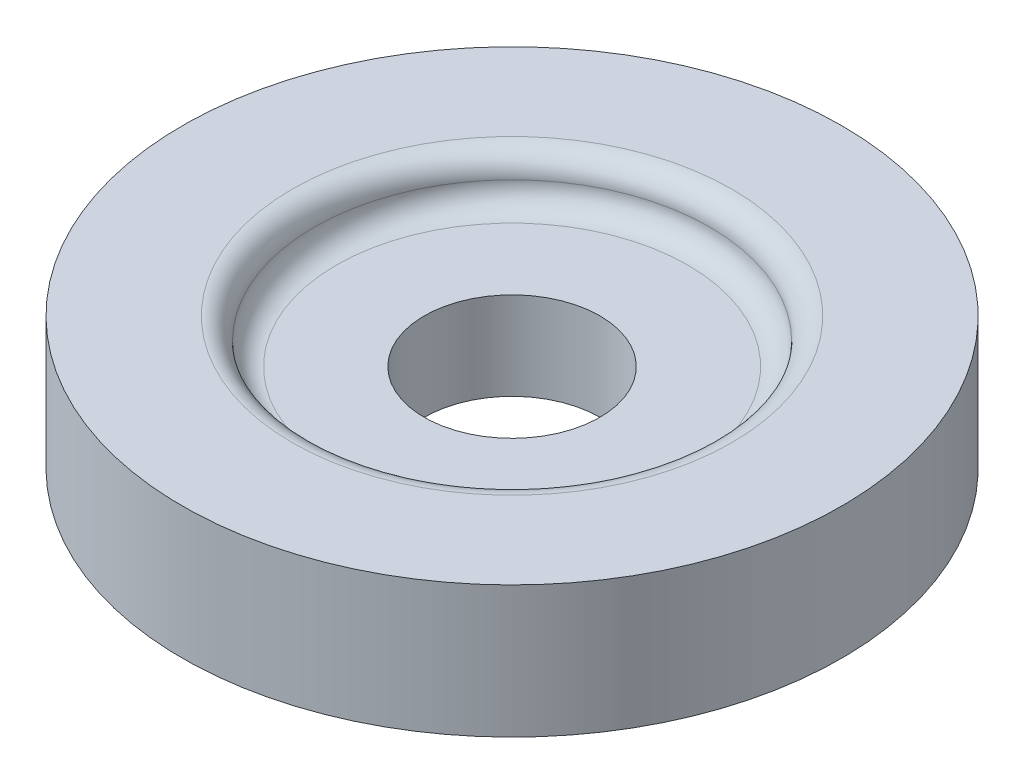
ISO-10303-21;
HEADER;
FILE_DESCRIPTION(('STEP AP214'),'2;1');
FILE_NAME('part.step','',(''),(''),'','','');
FILE_SCHEMA(('AUTOMOTIVE_DESIGN { 1 0 10303 214 1 1 1 1 }'));
ENDSEC;
DATA;
#1=APPLICATION_CONTEXT('core data for automotive mechanical design processes');
#2=APPLICATION_PROTOCOL_DEFINITION('international standard','automotive_design',2000,#1);
#3=PRODUCT_CONTEXT('',#1,'mechanical');
#4=PRODUCT('Part','Part','',(#3));
#5=PRODUCT_RELATED_PRODUCT_CATEGORY('part','',(#4));
#6=PRODUCT_DEFINITION_FORMATION('','',#4);
#7=PRODUCT_DEFINITION_CONTEXT('part definition',#1,'design');
#8=PRODUCT_DEFINITION('design','',#6,#7);
#9=PRODUCT_DEFINITION_SHAPE('','',#8);
#10=(LENGTH_UNIT() NAMED_UNIT(*) SI_UNIT(.MILLI.,.METRE.));
#11=(NAMED_UNIT(*) PLANE_ANGLE_UNIT() SI_UNIT($,.RADIAN.));
#12=(NAMED_UNIT(*) SI_UNIT($,.STERADIAN.) SOLID_ANGLE_UNIT());
#13=UNCERTAINTY_MEASURE_WITH_UNIT(LENGTH_MEASURE(1.E-05),#10,'distance_accuracy_value','');
#14=(GEOMETRIC_REPRESENTATION_CONTEXT(3) GLOBAL_UNCERTAINTY_ASSIGNED_CONTEXT((#13)) GLOBAL_UNIT_ASSIGNED_CONTEXT((#10,
#11,#12)) REPRESENTATION_CONTEXT('',''));
#15=CARTESIAN_POINT('',(0.,0.,0.));
#16=DIRECTION('',(0.,0.,1.));
#17=DIRECTION('',(1.,0.,0.));
#18=AXIS2_PLACEMENT_3D('',#15,#16,#17);
#19=CARTESIAN_POINT('',(0.,0.,0.));
#20=DIRECTION('',(0.,-1.,0.));
#21=DIRECTION('',(0.,0.,-1.));
#22=AXIS2_PLACEMENT_3D('',#19,#20,#21);
#23=CYLINDRICAL_SURFACE('',#22,7.5);
#24=CARTESIAN_POINT('',(0.,3.,0.));
#25=DIRECTION('',(0.,-1.,0.));
#26=DIRECTION('',(0.,0.,-1.));
#27=AXIS2_PLACEMENT_3D('',#24,#25,#26);
#28=CIRCLE('',#27,7.5);
#29=CARTESIAN_POINT('',(0.,3.,-7.5));
#30=VERTEX_POINT('',#29);
#31=EDGE_CURVE('E45',#30,#30,#28,.T.);
#32=ORIENTED_EDGE('',*,*,#31,.T.);
#33=EDGE_LOOP('',(#32));
#34=FACE_BOUND('',#33,.T.);
#35=CARTESIAN_POINT('',(0.,0.,0.));
#36=DIRECTION('',(0.,-1.,0.));
#37=DIRECTION('',(0.,0.,-1.));
#38=AXIS2_PLACEMENT_3D('',#35,#36,#37);
#39=CIRCLE('',#38,7.5);
#40=CARTESIAN_POINT('',(0.,0.,-7.5));
#41=VERTEX_POINT('',#40);
#42=EDGE_CURVE('E56',#41,#41,#39,.T.);
#43=ORIENTED_EDGE('',*,*,#42,.F.);
#44=EDGE_LOOP('',(#43));
#45=FACE_BOUND('',#44,.T.);
#46=ADVANCED_FACE('F33',(#34,#45),#23,.T.);
#47=CARTESIAN_POINT('',(7.5,3.,0.));
#48=DIRECTION('',(0.,1.,0.));
#49=DIRECTION('',(0.,0.,1.));
#50=AXIS2_PLACEMENT_3D('',#47,#48,#49);
#51=PLANE('',#50);
#52=CARTESIAN_POINT('',(0.,3.,0.));
#53=DIRECTION('',(0.,1.,0.));
#54=DIRECTION('',(0.,0.,1.));
#55=AXIS2_PLACEMENT_3D('',#52,#53,#54);
#56=CIRCLE('',#55,5.);
#57=CARTESIAN_POINT('',(0.,3.,5.));
#58=VERTEX_POINT('',#57);
#59=EDGE_CURVE('E10',#58,#58,#56,.F.);
#60=ORIENTED_EDGE('',*,*,#59,.T.);
#61=EDGE_LOOP('',(#60));
#62=FACE_BOUND('',#61,.T.);
#63=ORIENTED_EDGE('',*,*,#31,.F.);
#64=EDGE_LOOP('',(#63));
#65=FACE_BOUND('',#64,.T.);
#66=ADVANCED_FACE('F76',(#62,#65),#51,.T.);
#67=CARTESIAN_POINT('',(4.5,2.,0.));
#68=DIRECTION('',(0.,1.,0.));
#69=DIRECTION('',(0.,0.,1.));
#70=AXIS2_PLACEMENT_3D('',#67,#68,#69);
#71=PLANE('',#70);
#72=CARTESIAN_POINT('',(0.,2.,0.));
#73=DIRECTION('',(0.,1.,0.));
#74=DIRECTION('',(0.,0.,1.));
#75=AXIS2_PLACEMENT_3D('',#72,#73,#74);
#76=CIRCLE('',#75,4.);
#77=CARTESIAN_POINT('',(0.,2.,4.));
#78=VERTEX_POINT('',#77);
#79=EDGE_CURVE('E41',#78,#78,#76,.T.);
#80=ORIENTED_EDGE('',*,*,#79,.T.);
#81=EDGE_LOOP('',(#80));
#82=FACE_BOUND('',#81,.T.);
#83=CARTESIAN_POINT('',(0.,2.,0.));
#84=DIRECTION('',(0.,-1.,0.));
#85=DIRECTION('',(0.,0.,-1.));
#86=AXIS2_PLACEMENT_3D('',#83,#84,#85);
#87=CIRCLE('',#86,2.);
#88=CARTESIAN_POINT('',(0.,2.,-2.));
#89=VERTEX_POINT('',#88);
#90=EDGE_CURVE('E50',#89,#89,#87,.T.);
#91=ORIENTED_EDGE('',*,*,#90,.T.);
#92=EDGE_LOOP('',(#91));
#93=FACE_BOUND('',#92,.T.);
#94=ADVANCED_FACE('F82',(#82,#93),#71,.T.);
#95=CARTESIAN_POINT('',(0.,0.,0.));
#96=DIRECTION('',(0.,-1.,0.));
#97=DIRECTION('',(0.,0.,-1.));
#98=AXIS2_PLACEMENT_3D('',#95,#96,#97);
#99=CYLINDRICAL_SURFACE('',#98,2.);
#100=CARTESIAN_POINT('',(0.,0.,0.));
#101=DIRECTION('',(0.,-1.,0.));
#102=DIRECTION('',(0.,0.,-1.));
#103=AXIS2_PLACEMENT_3D('',#100,#101,#102);
#104=CIRCLE('',#103,2.);
#105=CARTESIAN_POINT('',(0.,0.,-2.));
#106=VERTEX_POINT('',#105);
#107=EDGE_CURVE('E53',#106,#106,#104,.T.);
#108=ORIENTED_EDGE('',*,*,#107,.T.);
#109=EDGE_LOOP('',(#108));
#110=FACE_BOUND('',#109,.T.);
#111=ORIENTED_EDGE('',*,*,#90,.F.);
#112=EDGE_LOOP('',(#111));
#113=FACE_BOUND('',#112,.T.);
#114=ADVANCED_FACE('F73',(#110,#113),#99,.F.);
#115=CARTESIAN_POINT('',(2.,0.,0.));
#116=DIRECTION('',(0.,-1.,0.));
#117=DIRECTION('',(0.,0.,-1.));
#118=AXIS2_PLACEMENT_3D('',#115,#116,#117);
#119=PLANE('',#118);
#120=ORIENTED_EDGE('',*,*,#42,.T.);
#121=EDGE_LOOP('',(#120));
#122=FACE_BOUND('',#121,.T.);
#123=ORIENTED_EDGE('',*,*,#107,.F.);
#124=EDGE_LOOP('',(#123));
#125=FACE_BOUND('',#124,.T.);
#126=ADVANCED_FACE('F66',(#122,#125),#119,.T.);
#127=CARTESIAN_POINT('',(0.,2.5,0.));
#128=DIRECTION('',(0.,1.,0.));
#129=DIRECTION('',(0.,0.,1.));
#130=AXIS2_PLACEMENT_3D('',#127,#128,#129);
#131=TOROIDAL_SURFACE('',#130,5.,0.5);
#132=ORIENTED_EDGE('',*,*,#59,.F.);
#133=EDGE_LOOP('',(#132));
#134=FACE_BOUND('',#133,.T.);
#135=CARTESIAN_POINT('',(0.,2.5,0.));
#136=DIRECTION('',(0.,1.,0.));
#137=DIRECTION('',(0.,0.,1.));
#138=AXIS2_PLACEMENT_3D('',#135,#136,#137);
#139=CIRCLE('',#138,4.5);
#140=CARTESIAN_POINT('',(0.,2.5,4.5));
#141=VERTEX_POINT('',#140);
#142=EDGE_CURVE('E37',#141,#141,#139,.T.);
#143=ORIENTED_EDGE('',*,*,#142,.F.);
#144=EDGE_LOOP('',(#143));
#145=FACE_BOUND('',#144,.T.);
#146=ADVANCED_FACE('F35',(#134,#145),#131,.T.);
#147=CARTESIAN_POINT('',(0.,2.5,0.));
#148=DIRECTION('',(0.,1.,0.));
#149=DIRECTION('',(0.,0.,1.));
#150=AXIS2_PLACEMENT_3D('',#147,#148,#149);
#151=TOROIDAL_SURFACE('',#150,4.,0.5);
#152=ORIENTED_EDGE('',*,*,#79,.F.);
#153=EDGE_LOOP('',(#152));
#154=FACE_BOUND('',#153,.T.);
#155=ORIENTED_EDGE('',*,*,#142,.T.);
#156=EDGE_LOOP('',(#155));
#157=FACE_BOUND('',#156,.T.);
#158=ADVANCED_FACE('F63',(#154,#157),#151,.F.);
#159=CLOSED_SHELL('',(#46,#66,#94,#114,#126,#146,#158));
#160=MANIFOLD_SOLID_BREP('B2',#159);
#161=ADVANCED_BREP_SHAPE_REPRESENTATION('',(#18,#160),#14);
#162=SHAPE_DEFINITION_REPRESENTATION(#9,#161);
ENDSEC;
END-ISO-10303-21;
